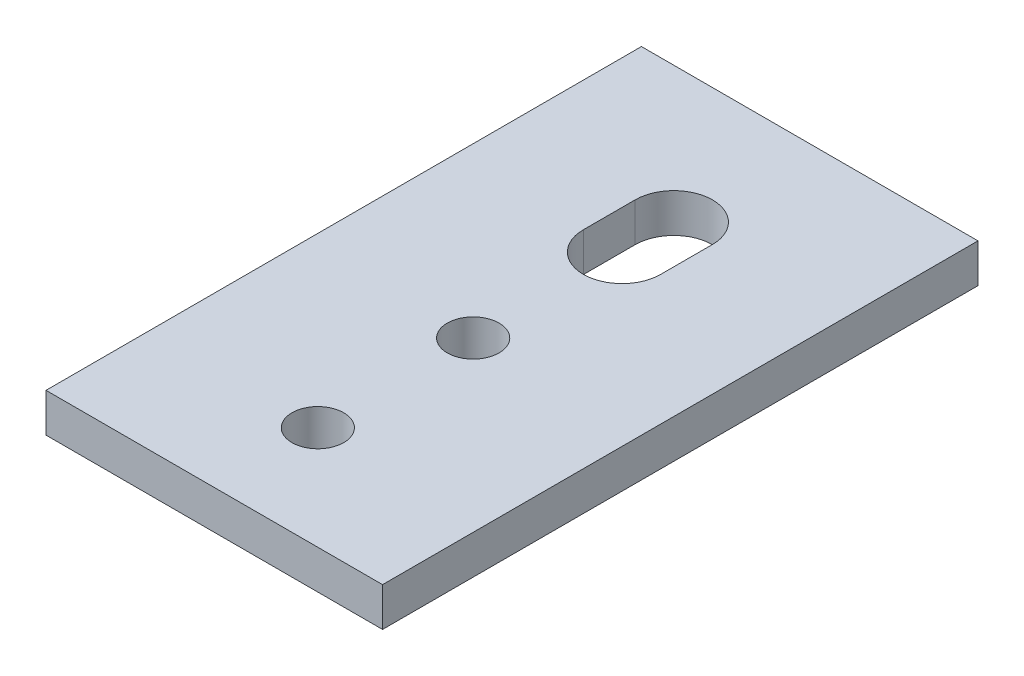
ISO-10303-21;
HEADER;
FILE_DESCRIPTION(('STEP AP214'),'2;1');
FILE_NAME('part.step','',(''),(''),'','','');
FILE_SCHEMA(('AUTOMOTIVE_DESIGN { 1 0 10303 214 1 1 1 1 }'));
ENDSEC;
DATA;
#1=APPLICATION_CONTEXT('core data for automotive mechanical design processes');
#2=APPLICATION_PROTOCOL_DEFINITION('international standard','automotive_design',2000,#1);
#3=PRODUCT_CONTEXT('',#1,'mechanical');
#4=PRODUCT('Part','Part','',(#3));
#5=PRODUCT_RELATED_PRODUCT_CATEGORY('part','',(#4));
#6=PRODUCT_DEFINITION_FORMATION('','',#4);
#7=PRODUCT_DEFINITION_CONTEXT('part definition',#1,'design');
#8=PRODUCT_DEFINITION('design','',#6,#7);
#9=PRODUCT_DEFINITION_SHAPE('','',#8);
#10=(LENGTH_UNIT() NAMED_UNIT(*) SI_UNIT(.MILLI.,.METRE.));
#11=(NAMED_UNIT(*) PLANE_ANGLE_UNIT() SI_UNIT($,.RADIAN.));
#12=(NAMED_UNIT(*) SI_UNIT($,.STERADIAN.) SOLID_ANGLE_UNIT());
#13=UNCERTAINTY_MEASURE_WITH_UNIT(LENGTH_MEASURE(1.E-05),#10,'distance_accuracy_value','');
#14=(GEOMETRIC_REPRESENTATION_CONTEXT(3) GLOBAL_UNCERTAINTY_ASSIGNED_CONTEXT((#13)) GLOBAL_UNIT_ASSIGNED_CONTEXT((#10,
#11,#12)) REPRESENTATION_CONTEXT('',''));
#15=CARTESIAN_POINT('',(0.,0.,0.));
#16=DIRECTION('',(0.,0.,1.));
#17=DIRECTION('',(1.,0.,0.));
#18=AXIS2_PLACEMENT_3D('',#15,#16,#17);
#19=CARTESIAN_POINT('',(0.,1.5,0.));
#20=DIRECTION('',(0.,-1.,0.));
#21=DIRECTION('',(0.,0.,-1.));
#22=AXIS2_PLACEMENT_3D('',#19,#20,#21);
#23=PLANE('',#22);
#24=CARTESIAN_POINT('',(0.,1.5,1.5));
#25=DIRECTION('',(0.,1.,0.));
#26=DIRECTION('',(0.,0.,1.));
#27=AXIS2_PLACEMENT_3D('',#24,#25,#26);
#28=CIRCLE('',#27,1.);
#29=CARTESIAN_POINT('',(0.,1.5,2.5));
#30=VERTEX_POINT('',#29);
#31=EDGE_CURVE('E127',#30,#30,#28,.T.);
#32=ORIENTED_EDGE('',*,*,#31,.F.);
#33=EDGE_LOOP('',(#32));
#34=FACE_BOUND('',#33,.T.);
#35=DIRECTION('',(0.,0.,-1.));
#36=VECTOR('',#35,1.);
#37=CARTESIAN_POINT('',(6.5,1.5,11.5));
#38=LINE('',#37,#36);
#39=CARTESIAN_POINT('',(6.5,1.5,11.5));
#40=VERTEX_POINT('',#39);
#41=CARTESIAN_POINT('',(6.5,1.5,-11.5));
#42=VERTEX_POINT('',#41);
#43=EDGE_CURVE('E137',#40,#42,#38,.T.);
#44=ORIENTED_EDGE('',*,*,#43,.T.);
#45=DIRECTION('',(-1.,0.,0.));
#46=VECTOR('',#45,1.);
#47=CARTESIAN_POINT('',(-6.5,1.5,-11.5));
#48=LINE('',#47,#46);
#49=CARTESIAN_POINT('',(-6.5,1.5,-11.5));
#50=VERTEX_POINT('',#49);
#51=EDGE_CURVE('E140',#42,#50,#48,.T.);
#52=ORIENTED_EDGE('',*,*,#51,.T.);
#53=DIRECTION('',(0.,0.,1.));
#54=VECTOR('',#53,1.);
#55=CARTESIAN_POINT('',(-6.5,1.5,11.5));
#56=LINE('',#55,#54);
#57=CARTESIAN_POINT('',(-6.5,1.5,11.5));
#58=VERTEX_POINT('',#57);
#59=EDGE_CURVE('E143',#50,#58,#56,.T.);
#60=ORIENTED_EDGE('',*,*,#59,.T.);
#61=DIRECTION('',(1.,0.,0.));
#62=VECTOR('',#61,1.);
#63=CARTESIAN_POINT('',(-6.5,1.5,11.5));
#64=LINE('',#63,#62);
#65=EDGE_CURVE('E145',#58,#40,#64,.T.);
#66=ORIENTED_EDGE('',*,*,#65,.T.);
#67=EDGE_LOOP('',(#44,#52,#60,#66));
#68=FACE_BOUND('',#67,.T.);
#69=CARTESIAN_POINT('',(0.,1.5,-6.25));
#70=DIRECTION('',(0.,1.,0.));
#71=DIRECTION('',(0.,0.,1.));
#72=AXIS2_PLACEMENT_3D('',#69,#70,#71);
#73=CIRCLE('',#72,1.49324324324324);
#74=CARTESIAN_POINT('',(1.49324324324324,1.5,-6.25));
#75=VERTEX_POINT('',#74);
#76=CARTESIAN_POINT('',(-1.49324324324324,1.5,-6.25));
#77=VERTEX_POINT('',#76);
#78=EDGE_CURVE('E98',#75,#77,#73,.T.);
#79=ORIENTED_EDGE('',*,*,#78,.F.);
#80=DIRECTION('',(0.,0.,-1.));
#81=VECTOR('',#80,1.);
#82=CARTESIAN_POINT('',(1.49324324324324,1.5,-4.25));
#83=LINE('',#82,#81);
#84=CARTESIAN_POINT('',(1.49324324324324,1.5,-4.25));
#85=VERTEX_POINT('',#84);
#86=EDGE_CURVE('E121',#85,#75,#83,.T.);
#87=ORIENTED_EDGE('',*,*,#86,.F.);
#88=CARTESIAN_POINT('',(0.,1.5,-4.25));
#89=DIRECTION('',(0.,1.,0.));
#90=DIRECTION('',(0.,0.,1.));
#91=AXIS2_PLACEMENT_3D('',#88,#89,#90);
#92=CIRCLE('',#91,1.49324324324324);
#93=CARTESIAN_POINT('',(-1.49324324324324,1.5,-4.25));
#94=VERTEX_POINT('',#93);
#95=EDGE_CURVE('E119',#94,#85,#92,.T.);
#96=ORIENTED_EDGE('',*,*,#95,.F.);
#97=DIRECTION('',(0.,0.,1.));
#98=VECTOR('',#97,1.);
#99=CARTESIAN_POINT('',(-1.49324324324324,1.5,-4.25));
#100=LINE('',#99,#98);
#101=EDGE_CURVE('E106',#77,#94,#100,.T.);
#102=ORIENTED_EDGE('',*,*,#101,.F.);
#103=EDGE_LOOP('',(#79,#87,#96,#102));
#104=FACE_BOUND('',#103,.T.);
#105=CARTESIAN_POINT('',(0.,1.5,7.5));
#106=DIRECTION('',(0.,1.,0.));
#107=DIRECTION('',(0.,0.,1.));
#108=AXIS2_PLACEMENT_3D('',#105,#106,#107);
#109=CIRCLE('',#108,1.);
#110=CARTESIAN_POINT('',(0.,1.5,8.5));
#111=VERTEX_POINT('',#110);
#112=EDGE_CURVE('E228',#111,#111,#109,.T.);
#113=ORIENTED_EDGE('',*,*,#112,.F.);
#114=EDGE_LOOP('',(#113));
#115=FACE_BOUND('',#114,.T.);
#116=ADVANCED_FACE('F33',(#34,#68,#104,#115),#23,.F.);
#117=CARTESIAN_POINT('',(0.,0.,0.));
#118=DIRECTION('',(0.,-1.,0.));
#119=DIRECTION('',(0.,0.,-1.));
#120=AXIS2_PLACEMENT_3D('',#117,#118,#119);
#121=PLANE('',#120);
#122=CARTESIAN_POINT('',(0.,0.,1.5));
#123=DIRECTION('',(0.,1.,0.));
#124=DIRECTION('',(0.,0.,1.));
#125=AXIS2_PLACEMENT_3D('',#122,#123,#124);
#126=CIRCLE('',#125,1.);
#127=CARTESIAN_POINT('',(0.,0.,2.5));
#128=VERTEX_POINT('',#127);
#129=EDGE_CURVE('E234',#128,#128,#126,.T.);
#130=ORIENTED_EDGE('',*,*,#129,.T.);
#131=EDGE_LOOP('',(#130));
#132=FACE_BOUND('',#131,.T.);
#133=DIRECTION('',(0.,0.,-1.));
#134=VECTOR('',#133,1.);
#135=CARTESIAN_POINT('',(6.5,0.,11.5));
#136=LINE('',#135,#134);
#137=CARTESIAN_POINT('',(6.5,0.,11.5));
#138=VERTEX_POINT('',#137);
#139=CARTESIAN_POINT('',(6.5,0.,-11.5));
#140=VERTEX_POINT('',#139);
#141=EDGE_CURVE('E114',#138,#140,#136,.T.);
#142=ORIENTED_EDGE('',*,*,#141,.F.);
#143=DIRECTION('',(1.,0.,0.));
#144=VECTOR('',#143,1.);
#145=CARTESIAN_POINT('',(-6.5,0.,11.5));
#146=LINE('',#145,#144);
#147=CARTESIAN_POINT('',(-6.5,0.,11.5));
#148=VERTEX_POINT('',#147);
#149=EDGE_CURVE('E141',#148,#138,#146,.T.);
#150=ORIENTED_EDGE('',*,*,#149,.F.);
#151=DIRECTION('',(0.,0.,1.));
#152=VECTOR('',#151,1.);
#153=CARTESIAN_POINT('',(-6.5,0.,11.5));
#154=LINE('',#153,#152);
#155=CARTESIAN_POINT('',(-6.5,0.,-11.5));
#156=VERTEX_POINT('',#155);
#157=EDGE_CURVE('E152',#156,#148,#154,.T.);
#158=ORIENTED_EDGE('',*,*,#157,.F.);
#159=DIRECTION('',(-1.,0.,0.));
#160=VECTOR('',#159,1.);
#161=CARTESIAN_POINT('',(-6.5,0.,-11.5));
#162=LINE('',#161,#160);
#163=EDGE_CURVE('E150',#140,#156,#162,.T.);
#164=ORIENTED_EDGE('',*,*,#163,.F.);
#165=EDGE_LOOP('',(#142,#150,#158,#164));
#166=FACE_BOUND('',#165,.T.);
#167=DIRECTION('',(0.,0.,-1.));
#168=VECTOR('',#167,1.);
#169=CARTESIAN_POINT('',(1.49324324324324,0.,-4.25));
#170=LINE('',#169,#168);
#171=CARTESIAN_POINT('',(1.49324324324324,0.,-4.25));
#172=VERTEX_POINT('',#171);
#173=CARTESIAN_POINT('',(1.49324324324324,0.,-6.25));
#174=VERTEX_POINT('',#173);
#175=EDGE_CURVE('E107',#172,#174,#170,.T.);
#176=ORIENTED_EDGE('',*,*,#175,.T.);
#177=CARTESIAN_POINT('',(0.,0.,-6.25));
#178=DIRECTION('',(0.,1.,0.));
#179=DIRECTION('',(0.,0.,1.));
#180=AXIS2_PLACEMENT_3D('',#177,#178,#179);
#181=CIRCLE('',#180,1.49324324324324);
#182=CARTESIAN_POINT('',(-1.49324324324324,0.,-6.25));
#183=VERTEX_POINT('',#182);
#184=EDGE_CURVE('E56',#174,#183,#181,.T.);
#185=ORIENTED_EDGE('',*,*,#184,.T.);
#186=DIRECTION('',(0.,0.,1.));
#187=VECTOR('',#186,1.);
#188=CARTESIAN_POINT('',(-1.49324324324324,0.,-4.25));
#189=LINE('',#188,#187);
#190=CARTESIAN_POINT('',(-1.49324324324324,0.,-4.25));
#191=VERTEX_POINT('',#190);
#192=EDGE_CURVE('E113',#183,#191,#189,.T.);
#193=ORIENTED_EDGE('',*,*,#192,.T.);
#194=CARTESIAN_POINT('',(0.,0.,-4.25));
#195=DIRECTION('',(0.,1.,0.));
#196=DIRECTION('',(0.,0.,1.));
#197=AXIS2_PLACEMENT_3D('',#194,#195,#196);
#198=CIRCLE('',#197,1.49324324324324);
#199=EDGE_CURVE('E129',#191,#172,#198,.T.);
#200=ORIENTED_EDGE('',*,*,#199,.T.);
#201=EDGE_LOOP('',(#176,#185,#193,#200));
#202=FACE_BOUND('',#201,.T.);
#203=CARTESIAN_POINT('',(0.,0.,7.5));
#204=DIRECTION('',(0.,1.,0.));
#205=DIRECTION('',(0.,0.,1.));
#206=AXIS2_PLACEMENT_3D('',#203,#204,#205);
#207=CIRCLE('',#206,1.);
#208=CARTESIAN_POINT('',(0.,0.,8.5));
#209=VERTEX_POINT('',#208);
#210=EDGE_CURVE('E231',#209,#209,#207,.T.);
#211=ORIENTED_EDGE('',*,*,#210,.T.);
#212=EDGE_LOOP('',(#211));
#213=FACE_BOUND('',#212,.T.);
#214=ADVANCED_FACE('F170',(#132,#166,#202,#213),#121,.T.);
#215=CARTESIAN_POINT('',(6.5,1.5,11.5));
#216=DIRECTION('',(-1.,0.,0.));
#217=DIRECTION('',(0.,0.,1.));
#218=AXIS2_PLACEMENT_3D('',#215,#216,#217);
#219=PLANE('',#218);
#220=ORIENTED_EDGE('',*,*,#141,.T.);
#221=DIRECTION('',(0.,-1.,0.));
#222=VECTOR('',#221,1.);
#223=CARTESIAN_POINT('',(6.5,1.5,-11.5));
#224=LINE('',#223,#222);
#225=EDGE_CURVE('E11',#42,#140,#224,.T.);
#226=ORIENTED_EDGE('',*,*,#225,.F.);
#227=ORIENTED_EDGE('',*,*,#43,.F.);
#228=DIRECTION('',(0.,-1.,0.));
#229=VECTOR('',#228,1.);
#230=CARTESIAN_POINT('',(6.5,1.5,11.5));
#231=LINE('',#230,#229);
#232=EDGE_CURVE('E147',#40,#138,#231,.T.);
#233=ORIENTED_EDGE('',*,*,#232,.T.);
#234=EDGE_LOOP('',(#220,#226,#227,#233));
#235=FACE_BOUND('',#234,.T.);
#236=ADVANCED_FACE('F35',(#235),#219,.F.);
#237=CARTESIAN_POINT('',(-6.5,1.5,-11.5));
#238=DIRECTION('',(0.,0.,1.));
#239=DIRECTION('',(1.,0.,0.));
#240=AXIS2_PLACEMENT_3D('',#237,#238,#239);
#241=PLANE('',#240);
#242=ORIENTED_EDGE('',*,*,#163,.T.);
#243=DIRECTION('',(0.,-1.,0.));
#244=VECTOR('',#243,1.);
#245=CARTESIAN_POINT('',(-6.5,1.5,-11.5));
#246=LINE('',#245,#244);
#247=EDGE_CURVE('E41',#50,#156,#246,.T.);
#248=ORIENTED_EDGE('',*,*,#247,.F.);
#249=ORIENTED_EDGE('',*,*,#51,.F.);
#250=ORIENTED_EDGE('',*,*,#225,.T.);
#251=EDGE_LOOP('',(#242,#248,#249,#250));
#252=FACE_BOUND('',#251,.T.);
#253=ADVANCED_FACE('F180',(#252),#241,.F.);
#254=CARTESIAN_POINT('',(-6.5,1.5,11.5));
#255=DIRECTION('',(1.,0.,0.));
#256=DIRECTION('',(0.,0.,-1.));
#257=AXIS2_PLACEMENT_3D('',#254,#255,#256);
#258=PLANE('',#257);
#259=ORIENTED_EDGE('',*,*,#157,.T.);
#260=DIRECTION('',(0.,-1.,0.));
#261=VECTOR('',#260,1.);
#262=CARTESIAN_POINT('',(-6.5,1.5,11.5));
#263=LINE('',#262,#261);
#264=EDGE_CURVE('E157',#58,#148,#263,.T.);
#265=ORIENTED_EDGE('',*,*,#264,.F.);
#266=ORIENTED_EDGE('',*,*,#59,.F.);
#267=ORIENTED_EDGE('',*,*,#247,.T.);
#268=EDGE_LOOP('',(#259,#265,#266,#267));
#269=FACE_BOUND('',#268,.T.);
#270=ADVANCED_FACE('F164',(#269),#258,.F.);
#271=CARTESIAN_POINT('',(-6.5,1.5,11.5));
#272=DIRECTION('',(0.,0.,-1.));
#273=DIRECTION('',(-1.,0.,0.));
#274=AXIS2_PLACEMENT_3D('',#271,#272,#273);
#275=PLANE('',#274);
#276=ORIENTED_EDGE('',*,*,#149,.T.);
#277=ORIENTED_EDGE('',*,*,#232,.F.);
#278=ORIENTED_EDGE('',*,*,#65,.F.);
#279=ORIENTED_EDGE('',*,*,#264,.T.);
#280=EDGE_LOOP('',(#276,#277,#278,#279));
#281=FACE_BOUND('',#280,.T.);
#282=ADVANCED_FACE('F174',(#281),#275,.F.);
#283=CARTESIAN_POINT('',(0.,1.5,-6.25));
#284=DIRECTION('',(0.,-1.,0.));
#285=DIRECTION('',(0.,0.,-1.));
#286=AXIS2_PLACEMENT_3D('',#283,#284,#285);
#287=CYLINDRICAL_SURFACE('',#286,1.49324324324324);
#288=ORIENTED_EDGE('',*,*,#184,.F.);
#289=DIRECTION('',(0.,-1.,0.));
#290=VECTOR('',#289,1.);
#291=CARTESIAN_POINT('',(1.49324324324324,1.5,-6.25));
#292=LINE('',#291,#290);
#293=EDGE_CURVE('E102',#75,#174,#292,.T.);
#294=ORIENTED_EDGE('',*,*,#293,.F.);
#295=ORIENTED_EDGE('',*,*,#78,.T.);
#296=DIRECTION('',(0.,-1.,0.));
#297=VECTOR('',#296,1.);
#298=CARTESIAN_POINT('',(-1.49324324324324,1.5,-6.25));
#299=LINE('',#298,#297);
#300=EDGE_CURVE('E101',#77,#183,#299,.T.);
#301=ORIENTED_EDGE('',*,*,#300,.T.);
#302=EDGE_LOOP('',(#288,#294,#295,#301));
#303=FACE_BOUND('',#302,.T.);
#304=ADVANCED_FACE('F100',(#303),#287,.F.);
#305=CARTESIAN_POINT('',(-1.49324324324324,1.5,-4.25));
#306=DIRECTION('',(1.,0.,0.));
#307=DIRECTION('',(0.,0.,-1.));
#308=AXIS2_PLACEMENT_3D('',#305,#306,#307);
#309=PLANE('',#308);
#310=ORIENTED_EDGE('',*,*,#192,.F.);
#311=ORIENTED_EDGE('',*,*,#300,.F.);
#312=ORIENTED_EDGE('',*,*,#101,.T.);
#313=DIRECTION('',(0.,-1.,0.));
#314=VECTOR('',#313,1.);
#315=CARTESIAN_POINT('',(-1.49324324324324,1.5,-4.25));
#316=LINE('',#315,#314);
#317=EDGE_CURVE('E115',#94,#191,#316,.T.);
#318=ORIENTED_EDGE('',*,*,#317,.T.);
#319=EDGE_LOOP('',(#310,#311,#312,#318));
#320=FACE_BOUND('',#319,.T.);
#321=ADVANCED_FACE('F110',(#320),#309,.T.);
#322=CARTESIAN_POINT('',(0.,1.5,-4.25));
#323=DIRECTION('',(0.,-1.,0.));
#324=DIRECTION('',(0.,0.,-1.));
#325=AXIS2_PLACEMENT_3D('',#322,#323,#324);
#326=CYLINDRICAL_SURFACE('',#325,1.49324324324324);
#327=ORIENTED_EDGE('',*,*,#199,.F.);
#328=ORIENTED_EDGE('',*,*,#317,.F.);
#329=ORIENTED_EDGE('',*,*,#95,.T.);
#330=DIRECTION('',(0.,-1.,0.));
#331=VECTOR('',#330,1.);
#332=CARTESIAN_POINT('',(1.49324324324324,1.5,-4.25));
#333=LINE('',#332,#331);
#334=EDGE_CURVE('E48',#85,#172,#333,.T.);
#335=ORIENTED_EDGE('',*,*,#334,.T.);
#336=EDGE_LOOP('',(#327,#328,#329,#335));
#337=FACE_BOUND('',#336,.T.);
#338=ADVANCED_FACE('F206',(#337),#326,.F.);
#339=CARTESIAN_POINT('',(1.49324324324324,1.5,-4.25));
#340=DIRECTION('',(-1.,0.,0.));
#341=DIRECTION('',(0.,0.,1.));
#342=AXIS2_PLACEMENT_3D('',#339,#340,#341);
#343=PLANE('',#342);
#344=ORIENTED_EDGE('',*,*,#175,.F.);
#345=ORIENTED_EDGE('',*,*,#334,.F.);
#346=ORIENTED_EDGE('',*,*,#86,.T.);
#347=ORIENTED_EDGE('',*,*,#293,.T.);
#348=EDGE_LOOP('',(#344,#345,#346,#347));
#349=FACE_BOUND('',#348,.T.);
#350=ADVANCED_FACE('F210',(#349),#343,.T.);
#351=CARTESIAN_POINT('',(0.,1.5,1.5));
#352=DIRECTION('',(0.,-1.,0.));
#353=DIRECTION('',(0.,0.,-1.));
#354=AXIS2_PLACEMENT_3D('',#351,#352,#353);
#355=CYLINDRICAL_SURFACE('',#354,1.);
#356=ORIENTED_EDGE('',*,*,#31,.T.);
#357=EDGE_LOOP('',(#356));
#358=FACE_BOUND('',#357,.T.);
#359=ORIENTED_EDGE('',*,*,#129,.F.);
#360=EDGE_LOOP('',(#359));
#361=FACE_BOUND('',#360,.T.);
#362=ADVANCED_FACE('F216',(#358,#361),#355,.F.);
#363=CARTESIAN_POINT('',(0.,1.5,7.5));
#364=DIRECTION('',(0.,-1.,0.));
#365=DIRECTION('',(0.,0.,-1.));
#366=AXIS2_PLACEMENT_3D('',#363,#364,#365);
#367=CYLINDRICAL_SURFACE('',#366,1.);
#368=ORIENTED_EDGE('',*,*,#112,.T.);
#369=EDGE_LOOP('',(#368));
#370=FACE_BOUND('',#369,.T.);
#371=ORIENTED_EDGE('',*,*,#210,.F.);
#372=EDGE_LOOP('',(#371));
#373=FACE_BOUND('',#372,.T.);
#374=ADVANCED_FACE('F219',(#370,#373),#367,.F.);
#375=CLOSED_SHELL('',(#116,#214,#236,#253,#270,#282,#304,#321,#338,#350,#362,#374));
#376=MANIFOLD_SOLID_BREP('B2',#375);
#377=ADVANCED_BREP_SHAPE_REPRESENTATION('',(#18,#376),#14);
#378=SHAPE_DEFINITION_REPRESENTATION(#9,#377);
ENDSEC;
END-ISO-10303-21;
